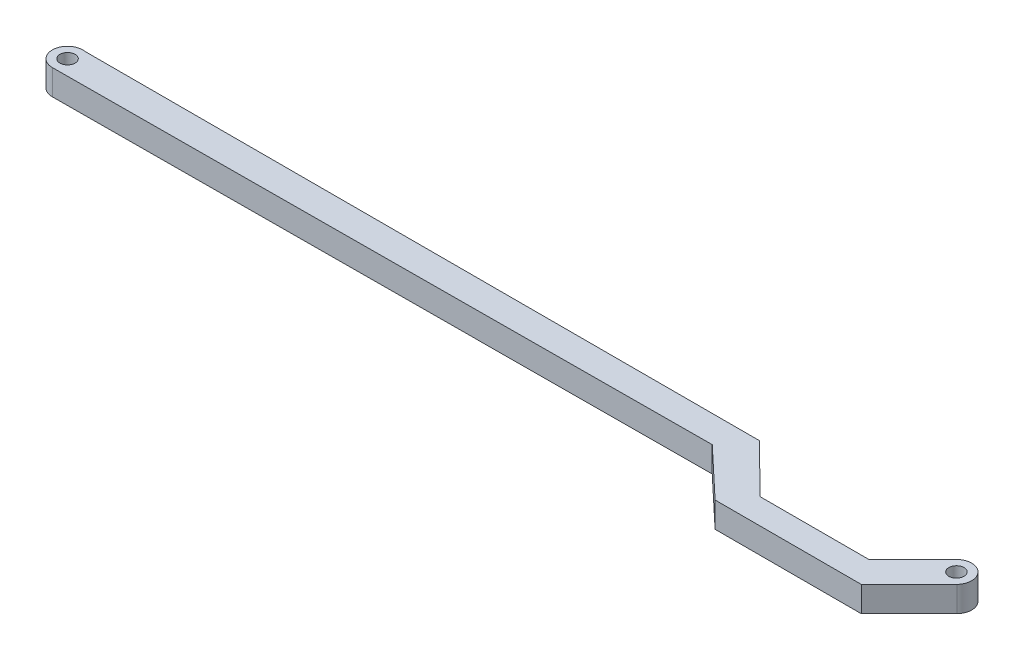
ISO-10303-21;
HEADER;
FILE_DESCRIPTION(('STEP AP214'),'2;1');
FILE_NAME('part.step','',(''),(''),'','','');
FILE_SCHEMA(('AUTOMOTIVE_DESIGN { 1 0 10303 214 1 1 1 1 }'));
ENDSEC;
DATA;
#1=APPLICATION_CONTEXT('core data for automotive mechanical design processes');
#2=APPLICATION_PROTOCOL_DEFINITION('international standard','automotive_design',2000,#1);
#3=PRODUCT_CONTEXT('',#1,'mechanical');
#4=PRODUCT('Part','Part','',(#3));
#5=PRODUCT_RELATED_PRODUCT_CATEGORY('part','',(#4));
#6=PRODUCT_DEFINITION_FORMATION('','',#4);
#7=PRODUCT_DEFINITION_CONTEXT('part definition',#1,'design');
#8=PRODUCT_DEFINITION('design','',#6,#7);
#9=PRODUCT_DEFINITION_SHAPE('','',#8);
#10=(LENGTH_UNIT() NAMED_UNIT(*) SI_UNIT(.MILLI.,.METRE.));
#11=(NAMED_UNIT(*) PLANE_ANGLE_UNIT() SI_UNIT($,.RADIAN.));
#12=(NAMED_UNIT(*) SI_UNIT($,.STERADIAN.) SOLID_ANGLE_UNIT());
#13=UNCERTAINTY_MEASURE_WITH_UNIT(LENGTH_MEASURE(1.E-05),#10,'distance_accuracy_value','');
#14=(GEOMETRIC_REPRESENTATION_CONTEXT(3) GLOBAL_UNCERTAINTY_ASSIGNED_CONTEXT((#13)) GLOBAL_UNIT_ASSIGNED_CONTEXT((#10,
#11,#12)) REPRESENTATION_CONTEXT('',''));
#15=CARTESIAN_POINT('',(0.,0.,0.));
#16=DIRECTION('',(0.,0.,1.));
#17=DIRECTION('',(1.,0.,0.));
#18=AXIS2_PLACEMENT_3D('',#15,#16,#17);
#19=CARTESIAN_POINT('',(0.,5.,0.));
#20=DIRECTION('',(0.,1.,0.));
#21=DIRECTION('',(0.,0.,1.));
#22=AXIS2_PLACEMENT_3D('',#19,#20,#21);
#23=PLANE('',#22);
#24=CARTESIAN_POINT('',(0.,5.,0.));
#25=DIRECTION('',(0.,1.,0.));
#26=DIRECTION('',(0.,0.,1.));
#27=AXIS2_PLACEMENT_3D('',#24,#25,#26);
#28=CIRCLE('',#27,1.5);
#29=CARTESIAN_POINT('',(0.,5.,1.5));
#30=VERTEX_POINT('',#29);
#31=EDGE_CURVE('E147',#30,#30,#28,.T.);
#32=ORIENTED_EDGE('',*,*,#31,.F.);
#33=EDGE_LOOP('',(#32));
#34=FACE_BOUND('',#33,.T.);
#35=DIRECTION('',(1.,0.,0.));
#36=VECTOR('',#35,1.);
#37=CARTESIAN_POINT('',(167.760423429611,5.,11.4943665268276));
#38=LINE('',#37,#36);
#39=CARTESIAN_POINT('',(138.979125154885,5.,11.4943665268276));
#40=VERTEX_POINT('',#39);
#41=CARTESIAN_POINT('',(167.760423429611,5.,11.4943665268276));
#42=VERTEX_POINT('',#41);
#43=EDGE_CURVE('E162',#40,#42,#38,.T.);
#44=ORIENTED_EDGE('',*,*,#43,.T.);
#45=DIRECTION('',(0.7066336277504,0.,-0.707579618228443));
#46=VECTOR('',#45,1.);
#47=CARTESIAN_POINT('',(177.151035774899,5.,2.09118270246914));
#48=LINE('',#47,#46);
#49=CARTESIAN_POINT('',(177.151035774899,5.,2.09118270246914));
#50=VERTEX_POINT('',#49);
#51=EDGE_CURVE('E100',#42,#50,#48,.T.);
#52=ORIENTED_EDGE('',*,*,#51,.T.);
#53=CARTESIAN_POINT('',(175.,5.,0.));
#54=DIRECTION('',(0.,1.,0.));
#55=DIRECTION('',(0.,0.,1.));
#56=AXIS2_PLACEMENT_3D('',#53,#54,#55);
#57=CIRCLE('',#56,3.00000000000001);
#58=CARTESIAN_POINT('',(172.6101495062,5.,-1.81345378140294));
#59=VERTEX_POINT('',#58);
#60=EDGE_CURVE('E183',#50,#59,#57,.T.);
#61=ORIENTED_EDGE('',*,*,#60,.T.);
#62=DIRECTION('',(-0.708714326707687,0.,0.705495572714153));
#63=VECTOR('',#62,1.);
#64=CARTESIAN_POINT('',(164.264425586907,5.,6.4943665268276));
#65=LINE('',#64,#63);
#66=CARTESIAN_POINT('',(164.264425586907,5.,6.4943665268276));
#67=VERTEX_POINT('',#66);
#68=EDGE_CURVE('E202',#59,#67,#65,.T.);
#69=ORIENTED_EDGE('',*,*,#68,.T.);
#70=DIRECTION('',(-1.,0.,0.));
#71=VECTOR('',#70,1.);
#72=CARTESIAN_POINT('',(142.859531647985,5.,6.4943665268276));
#73=LINE('',#72,#71);
#74=CARTESIAN_POINT('',(142.859531647985,5.,6.4943665268276));
#75=VERTEX_POINT('',#74);
#76=EDGE_CURVE('E199',#67,#75,#73,.T.);
#77=ORIENTED_EDGE('',*,*,#76,.T.);
#78=DIRECTION('',(-0.713584497419635,0.,-0.700569172203836));
#79=VECTOR('',#78,1.);
#80=CARTESIAN_POINT('',(133.197849193426,5.,-2.99109301407139));
#81=LINE('',#80,#79);
#82=CARTESIAN_POINT('',(133.197849193426,5.,-2.99109301407139));
#83=VERTEX_POINT('',#82);
#84=EDGE_CURVE('E201',#75,#83,#81,.T.);
#85=ORIENTED_EDGE('',*,*,#84,.T.);
#86=DIRECTION('',(-0.999999977299561,0.,0.000213074819227074));
#87=VECTOR('',#86,1.);
#88=CARTESIAN_POINT('',(133.197849193426,5.,-2.99109301407139));
#89=LINE('',#88,#87);
#90=CARTESIAN_POINT('',(0.470896611419563,5.,-2.96281224200144));
#91=VERTEX_POINT('',#90);
#92=EDGE_CURVE('E125',#83,#91,#89,.T.);
#93=ORIENTED_EDGE('',*,*,#92,.T.);
#94=CARTESIAN_POINT('',(0.,5.,0.));
#95=DIRECTION('',(0.,1.,0.));
#96=DIRECTION('',(0.,0.,1.));
#97=AXIS2_PLACEMENT_3D('',#94,#95,#96);
#98=CIRCLE('',#97,3.);
#99=CARTESIAN_POINT('',(0.,5.,3.));
#100=VERTEX_POINT('',#99);
#101=EDGE_CURVE('E119',#91,#100,#98,.T.);
#102=ORIENTED_EDGE('',*,*,#101,.T.);
#103=DIRECTION('',(0.999986840869049,0.,-0.00513011586023028));
#104=VECTOR('',#103,1.);
#105=CARTESIAN_POINT('',(0.,5.,3.));
#106=LINE('',#105,#104);
#107=CARTESIAN_POINT('',(129.261088854098,5.,2.33686691170381));
#108=VERTEX_POINT('',#107);
#109=EDGE_CURVE('E123',#100,#108,#106,.T.);
#110=ORIENTED_EDGE('',*,*,#109,.T.);
#111=DIRECTION('',(0.727784514150521,0.,0.685805877025481));
#112=VECTOR('',#111,1.);
#113=CARTESIAN_POINT('',(138.979125154885,5.,11.4943665268276));
#114=LINE('',#113,#112);
#115=EDGE_CURVE('E51',#108,#40,#114,.T.);
#116=ORIENTED_EDGE('',*,*,#115,.T.);
#117=EDGE_LOOP('',(#44,#52,#61,#69,#77,#85,#93,#102,#110,#116));
#118=FACE_BOUND('',#117,.T.);
#119=CARTESIAN_POINT('',(175.,5.,0.));
#120=DIRECTION('',(0.,1.,0.));
#121=DIRECTION('',(0.,0.,1.));
#122=AXIS2_PLACEMENT_3D('',#119,#120,#121);
#123=CIRCLE('',#122,1.5);
#124=CARTESIAN_POINT('',(175.,5.,1.5));
#125=VERTEX_POINT('',#124);
#126=EDGE_CURVE('E213',#125,#125,#123,.T.);
#127=ORIENTED_EDGE('',*,*,#126,.F.);
#128=EDGE_LOOP('',(#127));
#129=FACE_BOUND('',#128,.T.);
#130=ADVANCED_FACE('F34',(#34,#118,#129),#23,.T.);
#131=CARTESIAN_POINT('',(0.,0.,0.));
#132=DIRECTION('',(0.,1.,0.));
#133=DIRECTION('',(0.,0.,1.));
#134=AXIS2_PLACEMENT_3D('',#131,#132,#133);
#135=PLANE('',#134);
#136=DIRECTION('',(1.,0.,0.));
#137=VECTOR('',#136,1.);
#138=CARTESIAN_POINT('',(167.760423429611,0.,11.4943665268276));
#139=LINE('',#138,#137);
#140=CARTESIAN_POINT('',(138.979125154885,0.,11.4943665268276));
#141=VERTEX_POINT('',#140);
#142=CARTESIAN_POINT('',(167.760423429611,0.,11.4943665268276));
#143=VERTEX_POINT('',#142);
#144=EDGE_CURVE('E143',#141,#143,#139,.T.);
#145=ORIENTED_EDGE('',*,*,#144,.F.);
#146=DIRECTION('',(0.727784514150521,0.,0.685805877025481));
#147=VECTOR('',#146,1.);
#148=CARTESIAN_POINT('',(138.979125154885,0.,11.4943665268276));
#149=LINE('',#148,#147);
#150=CARTESIAN_POINT('',(129.261088854098,0.,2.33686691170381));
#151=VERTEX_POINT('',#150);
#152=EDGE_CURVE('E92',#151,#141,#149,.T.);
#153=ORIENTED_EDGE('',*,*,#152,.F.);
#154=DIRECTION('',(0.999986840869049,0.,-0.00513011586023028));
#155=VECTOR('',#154,1.);
#156=CARTESIAN_POINT('',(0.,0.,3.));
#157=LINE('',#156,#155);
#158=CARTESIAN_POINT('',(0.,0.,3.));
#159=VERTEX_POINT('',#158);
#160=EDGE_CURVE('E86',#159,#151,#157,.T.);
#161=ORIENTED_EDGE('',*,*,#160,.F.);
#162=CARTESIAN_POINT('',(0.,0.,0.));
#163=DIRECTION('',(0.,1.,0.));
#164=DIRECTION('',(0.,0.,1.));
#165=AXIS2_PLACEMENT_3D('',#162,#163,#164);
#166=CIRCLE('',#165,3.);
#167=CARTESIAN_POINT('',(0.470896611419563,0.,-2.96281224200144));
#168=VERTEX_POINT('',#167);
#169=EDGE_CURVE('E133',#168,#159,#166,.T.);
#170=ORIENTED_EDGE('',*,*,#169,.F.);
#171=DIRECTION('',(-0.999999977299561,0.,0.000213074819227074));
#172=VECTOR('',#171,1.);
#173=CARTESIAN_POINT('',(133.197849193426,0.,-2.99109301407139));
#174=LINE('',#173,#172);
#175=CARTESIAN_POINT('',(133.197849193426,0.,-2.99109301407139));
#176=VERTEX_POINT('',#175);
#177=EDGE_CURVE('E157',#176,#168,#174,.T.);
#178=ORIENTED_EDGE('',*,*,#177,.F.);
#179=DIRECTION('',(-0.713584497419635,0.,-0.700569172203836));
#180=VECTOR('',#179,1.);
#181=CARTESIAN_POINT('',(133.197849193426,0.,-2.99109301407139));
#182=LINE('',#181,#180);
#183=CARTESIAN_POINT('',(142.859531647985,0.,6.4943665268276));
#184=VERTEX_POINT('',#183);
#185=EDGE_CURVE('E155',#184,#176,#182,.T.);
#186=ORIENTED_EDGE('',*,*,#185,.F.);
#187=DIRECTION('',(-1.,0.,0.));
#188=VECTOR('',#187,1.);
#189=CARTESIAN_POINT('',(142.859531647985,0.,6.4943665268276));
#190=LINE('',#189,#188);
#191=CARTESIAN_POINT('',(164.264425586907,0.,6.4943665268276));
#192=VERTEX_POINT('',#191);
#193=EDGE_CURVE('E153',#192,#184,#190,.T.);
#194=ORIENTED_EDGE('',*,*,#193,.F.);
#195=DIRECTION('',(-0.708714326707687,0.,0.705495572714153));
#196=VECTOR('',#195,1.);
#197=CARTESIAN_POINT('',(164.264425586907,0.,6.4943665268276));
#198=LINE('',#197,#196);
#199=CARTESIAN_POINT('',(172.6101495062,0.,-1.81345378140294));
#200=VERTEX_POINT('',#199);
#201=EDGE_CURVE('E151',#200,#192,#198,.T.);
#202=ORIENTED_EDGE('',*,*,#201,.F.);
#203=CARTESIAN_POINT('',(175.,0.,0.));
#204=DIRECTION('',(0.,1.,0.));
#205=DIRECTION('',(0.,0.,1.));
#206=AXIS2_PLACEMENT_3D('',#203,#204,#205);
#207=CIRCLE('',#206,3.00000000000001);
#208=CARTESIAN_POINT('',(177.151035774899,0.,2.09118270246914));
#209=VERTEX_POINT('',#208);
#210=EDGE_CURVE('E149',#209,#200,#207,.T.);
#211=ORIENTED_EDGE('',*,*,#210,.F.);
#212=DIRECTION('',(0.7066336277504,0.,-0.707579618228443));
#213=VECTOR('',#212,1.);
#214=CARTESIAN_POINT('',(177.151035774899,0.,2.09118270246914));
#215=LINE('',#214,#213);
#216=EDGE_CURVE('E146',#143,#209,#215,.T.);
#217=ORIENTED_EDGE('',*,*,#216,.F.);
#218=EDGE_LOOP('',(#145,#153,#161,#170,#178,#186,#194,#202,#211,#217));
#219=FACE_BOUND('',#218,.T.);
#220=CARTESIAN_POINT('',(0.,0.,0.));
#221=DIRECTION('',(0.,1.,0.));
#222=DIRECTION('',(0.,0.,1.));
#223=AXIS2_PLACEMENT_3D('',#220,#221,#222);
#224=CIRCLE('',#223,1.5);
#225=CARTESIAN_POINT('',(0.,0.,1.5));
#226=VERTEX_POINT('',#225);
#227=EDGE_CURVE('E210',#226,#226,#224,.T.);
#228=ORIENTED_EDGE('',*,*,#227,.T.);
#229=EDGE_LOOP('',(#228));
#230=FACE_BOUND('',#229,.T.);
#231=CARTESIAN_POINT('',(175.,0.,0.));
#232=DIRECTION('',(0.,1.,0.));
#233=DIRECTION('',(0.,0.,1.));
#234=AXIS2_PLACEMENT_3D('',#231,#232,#233);
#235=CIRCLE('',#234,1.5);
#236=CARTESIAN_POINT('',(175.,0.,1.5));
#237=VERTEX_POINT('',#236);
#238=EDGE_CURVE('E216',#237,#237,#235,.T.);
#239=ORIENTED_EDGE('',*,*,#238,.T.);
#240=EDGE_LOOP('',(#239));
#241=FACE_BOUND('',#240,.T.);
#242=ADVANCED_FACE('F187',(#219,#230,#241),#135,.F.);
#243=CARTESIAN_POINT('',(167.760423429611,5.,11.4943665268276));
#244=DIRECTION('',(0.,0.,-1.));
#245=DIRECTION('',(-1.,0.,0.));
#246=AXIS2_PLACEMENT_3D('',#243,#244,#245);
#247=PLANE('',#246);
#248=ORIENTED_EDGE('',*,*,#144,.T.);
#249=DIRECTION('',(0.,-1.,0.));
#250=VECTOR('',#249,1.);
#251=CARTESIAN_POINT('',(167.760423429611,5.,11.4943665268276));
#252=LINE('',#251,#250);
#253=EDGE_CURVE('E11',#42,#143,#252,.T.);
#254=ORIENTED_EDGE('',*,*,#253,.F.);
#255=ORIENTED_EDGE('',*,*,#43,.F.);
#256=DIRECTION('',(0.,-1.,0.));
#257=VECTOR('',#256,1.);
#258=CARTESIAN_POINT('',(138.979125154885,5.,11.4943665268276));
#259=LINE('',#258,#257);
#260=EDGE_CURVE('E139',#40,#141,#259,.T.);
#261=ORIENTED_EDGE('',*,*,#260,.T.);
#262=EDGE_LOOP('',(#248,#254,#255,#261));
#263=FACE_BOUND('',#262,.T.);
#264=ADVANCED_FACE('F36',(#263),#247,.F.);
#265=CARTESIAN_POINT('',(177.151035774899,5.,2.09118270246914));
#266=DIRECTION('',(-0.707579618228443,0.,-0.7066336277504));
#267=DIRECTION('',(-0.7066336277504,0.,0.707579618228443));
#268=AXIS2_PLACEMENT_3D('',#265,#266,#267);
#269=PLANE('',#268);
#270=ORIENTED_EDGE('',*,*,#216,.T.);
#271=DIRECTION('',(0.,-1.,0.));
#272=VECTOR('',#271,1.);
#273=CARTESIAN_POINT('',(177.151035774899,5.,2.09118270246914));
#274=LINE('',#273,#272);
#275=EDGE_CURVE('E43',#50,#209,#274,.T.);
#276=ORIENTED_EDGE('',*,*,#275,.F.);
#277=ORIENTED_EDGE('',*,*,#51,.F.);
#278=ORIENTED_EDGE('',*,*,#253,.T.);
#279=EDGE_LOOP('',(#270,#276,#277,#278));
#280=FACE_BOUND('',#279,.T.);
#281=ADVANCED_FACE('F256',(#280),#269,.F.);
#282=CARTESIAN_POINT('',(175.,5.,0.));
#283=DIRECTION('',(0.,-1.,0.));
#284=DIRECTION('',(0.,0.,-1.));
#285=AXIS2_PLACEMENT_3D('',#282,#283,#284);
#286=CYLINDRICAL_SURFACE('',#285,3.00000000000001);
#287=ORIENTED_EDGE('',*,*,#210,.T.);
#288=DIRECTION('',(0.,-1.,0.));
#289=VECTOR('',#288,1.);
#290=CARTESIAN_POINT('',(172.6101495062,5.,-1.81345378140294));
#291=LINE('',#290,#289);
#292=EDGE_CURVE('E175',#59,#200,#291,.T.);
#293=ORIENTED_EDGE('',*,*,#292,.F.);
#294=ORIENTED_EDGE('',*,*,#60,.F.);
#295=ORIENTED_EDGE('',*,*,#275,.T.);
#296=EDGE_LOOP('',(#287,#293,#294,#295));
#297=FACE_BOUND('',#296,.T.);
#298=ADVANCED_FACE('F181',(#297),#286,.T.);
#299=CARTESIAN_POINT('',(164.264425586907,5.,6.4943665268276));
#300=DIRECTION('',(0.705495572714153,0.,0.708714326707687));
#301=DIRECTION('',(0.708714326707687,0.,-0.705495572714153));
#302=AXIS2_PLACEMENT_3D('',#299,#300,#301);
#303=PLANE('',#302);
#304=ORIENTED_EDGE('',*,*,#201,.T.);
#305=DIRECTION('',(0.,-1.,0.));
#306=VECTOR('',#305,1.);
#307=CARTESIAN_POINT('',(164.264425586907,5.,6.4943665268276));
#308=LINE('',#307,#306);
#309=EDGE_CURVE('E172',#67,#192,#308,.T.);
#310=ORIENTED_EDGE('',*,*,#309,.F.);
#311=ORIENTED_EDGE('',*,*,#68,.F.);
#312=ORIENTED_EDGE('',*,*,#292,.T.);
#313=EDGE_LOOP('',(#304,#310,#311,#312));
#314=FACE_BOUND('',#313,.T.);
#315=ADVANCED_FACE('F193',(#314),#303,.F.);
#316=CARTESIAN_POINT('',(142.859531647985,5.,6.4943665268276));
#317=DIRECTION('',(0.,0.,1.));
#318=DIRECTION('',(1.,0.,0.));
#319=AXIS2_PLACEMENT_3D('',#316,#317,#318);
#320=PLANE('',#319);
#321=ORIENTED_EDGE('',*,*,#193,.T.);
#322=DIRECTION('',(0.,-1.,0.));
#323=VECTOR('',#322,1.);
#324=CARTESIAN_POINT('',(142.859531647985,5.,6.4943665268276));
#325=LINE('',#324,#323);
#326=EDGE_CURVE('E169',#75,#184,#325,.T.);
#327=ORIENTED_EDGE('',*,*,#326,.F.);
#328=ORIENTED_EDGE('',*,*,#76,.F.);
#329=ORIENTED_EDGE('',*,*,#309,.T.);
#330=EDGE_LOOP('',(#321,#327,#328,#329));
#331=FACE_BOUND('',#330,.T.);
#332=ADVANCED_FACE('F197',(#331),#320,.F.);
#333=CARTESIAN_POINT('',(133.197849193426,5.,-2.99109301407139));
#334=DIRECTION('',(-0.700569172203836,0.,0.713584497419635));
#335=DIRECTION('',(0.713584497419635,0.,0.700569172203836));
#336=AXIS2_PLACEMENT_3D('',#333,#334,#335);
#337=PLANE('',#336);
#338=ORIENTED_EDGE('',*,*,#185,.T.);
#339=DIRECTION('',(0.,-1.,0.));
#340=VECTOR('',#339,1.);
#341=CARTESIAN_POINT('',(133.197849193426,5.,-2.99109301407139));
#342=LINE('',#341,#340);
#343=EDGE_CURVE('E166',#83,#176,#342,.T.);
#344=ORIENTED_EDGE('',*,*,#343,.F.);
#345=ORIENTED_EDGE('',*,*,#84,.F.);
#346=ORIENTED_EDGE('',*,*,#326,.T.);
#347=EDGE_LOOP('',(#338,#344,#345,#346));
#348=FACE_BOUND('',#347,.T.);
#349=ADVANCED_FACE('F246',(#348),#337,.F.);
#350=CARTESIAN_POINT('',(133.197849193426,5.,-2.99109301407139));
#351=DIRECTION('',(0.000213074819227074,0.,0.999999977299561));
#352=DIRECTION('',(0.999999977299561,0.,-0.000213074819227074));
#353=AXIS2_PLACEMENT_3D('',#350,#351,#352);
#354=PLANE('',#353);
#355=ORIENTED_EDGE('',*,*,#177,.T.);
#356=DIRECTION('',(0.,-1.,0.));
#357=VECTOR('',#356,1.);
#358=CARTESIAN_POINT('',(0.470896611419563,5.,-2.96281224200144));
#359=LINE('',#358,#357);
#360=EDGE_CURVE('E134',#91,#168,#359,.T.);
#361=ORIENTED_EDGE('',*,*,#360,.F.);
#362=ORIENTED_EDGE('',*,*,#92,.F.);
#363=ORIENTED_EDGE('',*,*,#343,.T.);
#364=EDGE_LOOP('',(#355,#361,#362,#363));
#365=FACE_BOUND('',#364,.T.);
#366=ADVANCED_FACE('F243',(#365),#354,.F.);
#367=CARTESIAN_POINT('',(0.,5.,0.));
#368=DIRECTION('',(0.,-1.,0.));
#369=DIRECTION('',(0.,0.,-1.));
#370=AXIS2_PLACEMENT_3D('',#367,#368,#369);
#371=CYLINDRICAL_SURFACE('',#370,3.);
#372=ORIENTED_EDGE('',*,*,#169,.T.);
#373=DIRECTION('',(0.,-1.,0.));
#374=VECTOR('',#373,1.);
#375=CARTESIAN_POINT('',(0.,5.,3.));
#376=LINE('',#375,#374);
#377=EDGE_CURVE('E130',#100,#159,#376,.T.);
#378=ORIENTED_EDGE('',*,*,#377,.F.);
#379=ORIENTED_EDGE('',*,*,#101,.F.);
#380=ORIENTED_EDGE('',*,*,#360,.T.);
#381=EDGE_LOOP('',(#372,#378,#379,#380));
#382=FACE_BOUND('',#381,.T.);
#383=ADVANCED_FACE('F131',(#382),#371,.T.);
#384=CARTESIAN_POINT('',(0.,5.,3.));
#385=DIRECTION('',(-0.00513011586023028,0.,-0.999986840869049));
#386=DIRECTION('',(-0.999986840869049,0.,0.00513011586023028));
#387=AXIS2_PLACEMENT_3D('',#384,#385,#386);
#388=PLANE('',#387);
#389=ORIENTED_EDGE('',*,*,#160,.T.);
#390=DIRECTION('',(0.,-1.,0.));
#391=VECTOR('',#390,1.);
#392=CARTESIAN_POINT('',(129.261088854098,5.,2.33686691170381));
#393=LINE('',#392,#391);
#394=EDGE_CURVE('E135',#108,#151,#393,.T.);
#395=ORIENTED_EDGE('',*,*,#394,.F.);
#396=ORIENTED_EDGE('',*,*,#109,.F.);
#397=ORIENTED_EDGE('',*,*,#377,.T.);
#398=EDGE_LOOP('',(#389,#395,#396,#397));
#399=FACE_BOUND('',#398,.T.);
#400=ADVANCED_FACE('F137',(#399),#388,.F.);
#401=CARTESIAN_POINT('',(138.979125154885,5.,11.4943665268276));
#402=DIRECTION('',(0.685805877025481,0.,-0.727784514150521));
#403=DIRECTION('',(-0.727784514150522,0.,-0.685805877025481));
#404=AXIS2_PLACEMENT_3D('',#401,#402,#403);
#405=PLANE('',#404);
#406=ORIENTED_EDGE('',*,*,#152,.T.);
#407=ORIENTED_EDGE('',*,*,#260,.F.);
#408=ORIENTED_EDGE('',*,*,#115,.F.);
#409=ORIENTED_EDGE('',*,*,#394,.T.);
#410=EDGE_LOOP('',(#406,#407,#408,#409));
#411=FACE_BOUND('',#410,.T.);
#412=ADVANCED_FACE('F236',(#411),#405,.F.);
#413=CARTESIAN_POINT('',(0.,5.,0.));
#414=DIRECTION('',(0.,-1.,0.));
#415=DIRECTION('',(0.,0.,-1.));
#416=AXIS2_PLACEMENT_3D('',#413,#414,#415);
#417=CYLINDRICAL_SURFACE('',#416,1.5);
#418=ORIENTED_EDGE('',*,*,#31,.T.);
#419=EDGE_LOOP('',(#418));
#420=FACE_BOUND('',#419,.T.);
#421=ORIENTED_EDGE('',*,*,#227,.F.);
#422=EDGE_LOOP('',(#421));
#423=FACE_BOUND('',#422,.T.);
#424=ADVANCED_FACE('F233',(#420,#423),#417,.F.);
#425=CARTESIAN_POINT('',(175.,5.,0.));
#426=DIRECTION('',(0.,-1.,0.));
#427=DIRECTION('',(0.,0.,-1.));
#428=AXIS2_PLACEMENT_3D('',#425,#426,#427);
#429=CYLINDRICAL_SURFACE('',#428,1.5);
#430=ORIENTED_EDGE('',*,*,#126,.T.);
#431=EDGE_LOOP('',(#430));
#432=FACE_BOUND('',#431,.T.);
#433=ORIENTED_EDGE('',*,*,#238,.F.);
#434=EDGE_LOOP('',(#433));
#435=FACE_BOUND('',#434,.T.);
#436=ADVANCED_FACE('F222',(#432,#435),#429,.F.);
#437=CLOSED_SHELL('',(#130,#242,#264,#281,#298,#315,#332,#349,#366,#383,#400,#412,#424,#436));
#438=MANIFOLD_SOLID_BREP('B2',#437);
#439=ADVANCED_BREP_SHAPE_REPRESENTATION('',(#18,#438),#14);
#440=SHAPE_DEFINITION_REPRESENTATION(#9,#439);
ENDSEC;
END-ISO-10303-21;
